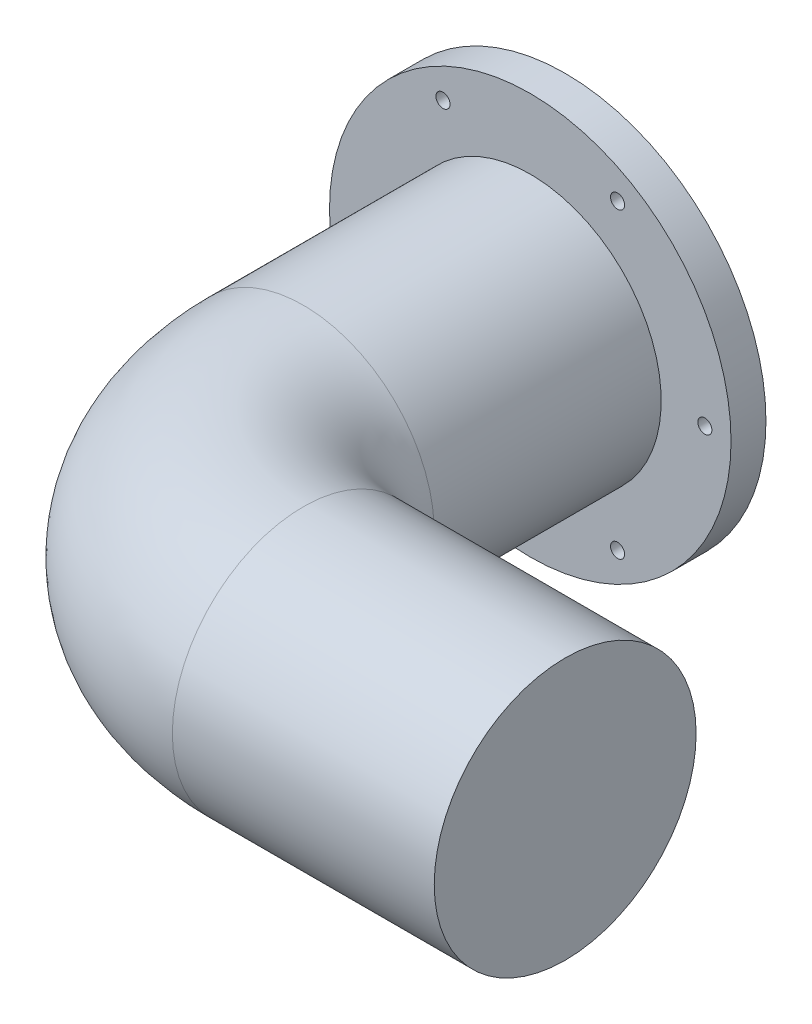
ISO-10303-21;
HEADER;
FILE_DESCRIPTION(('STEP AP214'),'2;1');
FILE_NAME('part.step','',(''),(''),'','','');
FILE_SCHEMA(('AUTOMOTIVE_DESIGN { 1 0 10303 214 1 1 1 1 }'));
ENDSEC;
DATA;
#1=APPLICATION_CONTEXT('core data for automotive mechanical design processes');
#2=APPLICATION_PROTOCOL_DEFINITION('international standard','automotive_design',2000,#1);
#3=PRODUCT_CONTEXT('',#1,'mechanical');
#4=PRODUCT('Part','Part','',(#3));
#5=PRODUCT_RELATED_PRODUCT_CATEGORY('part','',(#4));
#6=PRODUCT_DEFINITION_FORMATION('','',#4);
#7=PRODUCT_DEFINITION_CONTEXT('part definition',#1,'design');
#8=PRODUCT_DEFINITION('design','',#6,#7);
#9=PRODUCT_DEFINITION_SHAPE('','',#8);
#10=(LENGTH_UNIT() NAMED_UNIT(*) SI_UNIT(.MILLI.,.METRE.));
#11=(NAMED_UNIT(*) PLANE_ANGLE_UNIT() SI_UNIT($,.RADIAN.));
#12=(NAMED_UNIT(*) SI_UNIT($,.STERADIAN.) SOLID_ANGLE_UNIT());
#13=UNCERTAINTY_MEASURE_WITH_UNIT(LENGTH_MEASURE(1.E-05),#10,'distance_accuracy_value','');
#14=(GEOMETRIC_REPRESENTATION_CONTEXT(3) GLOBAL_UNCERTAINTY_ASSIGNED_CONTEXT((#13)) GLOBAL_UNIT_ASSIGNED_CONTEXT((#10,
#11,#12)) REPRESENTATION_CONTEXT('',''));
#15=CARTESIAN_POINT('',(0.,0.,0.));
#16=DIRECTION('',(0.,0.,1.));
#17=DIRECTION('',(1.,0.,0.));
#18=AXIS2_PLACEMENT_3D('',#15,#16,#17);
#19=CARTESIAN_POINT('',(-125.,0.,-115.));
#20=DIRECTION('',(0.,0.,-1.));
#21=DIRECTION('',(-1.,0.,0.));
#22=AXIS2_PLACEMENT_3D('',#19,#20,#21);
#23=PLANE('',#22);
#24=CARTESIAN_POINT('',(-150.,43.3012701892219,-115.));
#25=DIRECTION('',(0.,0.,1.));
#26=DIRECTION('',(1.,0.,0.));
#27=AXIS2_PLACEMENT_3D('',#24,#25,#26);
#28=CIRCLE('',#27,2.0193);
#29=CARTESIAN_POINT('',(-147.9807,43.3012701892219,-115.));
#30=VERTEX_POINT('',#29);
#31=EDGE_CURVE('E131',#30,#30,#28,.T.);
#32=ORIENTED_EDGE('',*,*,#31,.F.);
#33=EDGE_LOOP('',(#32));
#34=FACE_BOUND('',#33,.T.);
#35=CARTESIAN_POINT('',(-125.,0.,-115.));
#36=DIRECTION('',(0.,0.,-1.));
#37=DIRECTION('',(-1.,0.,0.));
#38=AXIS2_PLACEMENT_3D('',#35,#36,#37);
#39=CIRCLE('',#38,37.5);
#40=CARTESIAN_POINT('',(-162.5,0.,-115.));
#41=VERTEX_POINT('',#40);
#42=EDGE_CURVE('E11',#41,#41,#39,.T.);
#43=ORIENTED_EDGE('',*,*,#42,.T.);
#44=EDGE_LOOP('',(#43));
#45=FACE_BOUND('',#44,.T.);
#46=CARTESIAN_POINT('',(-125.,0.,-115.));
#47=DIRECTION('',(0.,0.,-1.));
#48=DIRECTION('',(-1.,0.,0.));
#49=AXIS2_PLACEMENT_3D('',#46,#47,#48);
#50=CIRCLE('',#49,57.5);
#51=CARTESIAN_POINT('',(-182.5,0.,-115.));
#52=VERTEX_POINT('',#51);
#53=EDGE_CURVE('E79',#52,#52,#50,.T.);
#54=ORIENTED_EDGE('',*,*,#53,.F.);
#55=EDGE_LOOP('',(#54));
#56=FACE_BOUND('',#55,.T.);
#57=CARTESIAN_POINT('',(-100.,43.3012701892219,-115.));
#58=DIRECTION('',(0.,0.,1.));
#59=DIRECTION('',(1.,0.,0.));
#60=AXIS2_PLACEMENT_3D('',#57,#58,#59);
#61=CIRCLE('',#60,2.0193);
#62=CARTESIAN_POINT('',(-97.9807,43.3012701892219,-115.));
#63=VERTEX_POINT('',#62);
#64=EDGE_CURVE('E91',#63,#63,#61,.T.);
#65=ORIENTED_EDGE('',*,*,#64,.F.);
#66=EDGE_LOOP('',(#65));
#67=FACE_BOUND('',#66,.T.);
#68=CARTESIAN_POINT('',(-75.,0.,-115.));
#69=DIRECTION('',(0.,0.,1.));
#70=DIRECTION('',(1.,0.,0.));
#71=AXIS2_PLACEMENT_3D('',#68,#69,#70);
#72=CIRCLE('',#71,2.0193);
#73=CARTESIAN_POINT('',(-72.9807,0.,-115.));
#74=VERTEX_POINT('',#73);
#75=EDGE_CURVE('E99',#74,#74,#72,.T.);
#76=ORIENTED_EDGE('',*,*,#75,.F.);
#77=EDGE_LOOP('',(#76));
#78=FACE_BOUND('',#77,.T.);
#79=CARTESIAN_POINT('',(-100.,-43.3012701892219,-115.));
#80=DIRECTION('',(0.,0.,1.));
#81=DIRECTION('',(1.,0.,0.));
#82=AXIS2_PLACEMENT_3D('',#79,#80,#81);
#83=CIRCLE('',#82,2.0193);
#84=CARTESIAN_POINT('',(-97.9807,-43.3012701892219,-115.));
#85=VERTEX_POINT('',#84);
#86=EDGE_CURVE('E107',#85,#85,#83,.T.);
#87=ORIENTED_EDGE('',*,*,#86,.F.);
#88=EDGE_LOOP('',(#87));
#89=FACE_BOUND('',#88,.T.);
#90=CARTESIAN_POINT('',(-150.,-43.3012701892219,-115.));
#91=DIRECTION('',(0.,0.,1.));
#92=DIRECTION('',(1.,0.,0.));
#93=AXIS2_PLACEMENT_3D('',#90,#91,#92);
#94=CIRCLE('',#93,2.0193);
#95=CARTESIAN_POINT('',(-147.9807,-43.3012701892219,-115.));
#96=VERTEX_POINT('',#95);
#97=EDGE_CURVE('E115',#96,#96,#94,.T.);
#98=ORIENTED_EDGE('',*,*,#97,.F.);
#99=EDGE_LOOP('',(#98));
#100=FACE_BOUND('',#99,.T.);
#101=CARTESIAN_POINT('',(-175.,0.,-115.));
#102=DIRECTION('',(0.,0.,1.));
#103=DIRECTION('',(1.,0.,0.));
#104=AXIS2_PLACEMENT_3D('',#101,#102,#103);
#105=CIRCLE('',#104,2.0193);
#106=CARTESIAN_POINT('',(-172.9807,0.,-115.));
#107=VERTEX_POINT('',#106);
#108=EDGE_CURVE('E123',#107,#107,#105,.T.);
#109=ORIENTED_EDGE('',*,*,#108,.F.);
#110=EDGE_LOOP('',(#109));
#111=FACE_BOUND('',#110,.T.);
#112=ADVANCED_FACE('F55',(#34,#45,#56,#67,#78,#89,#100,#111),#23,.F.);
#113=CARTESIAN_POINT('',(-125.,0.,-50.));
#114=DIRECTION('',(0.,0.,-1.));
#115=DIRECTION('',(-1.,0.,0.));
#116=AXIS2_PLACEMENT_3D('',#113,#114,#115);
#117=CYLINDRICAL_SURFACE('',#116,37.5);
#118=CARTESIAN_POINT('',(-125.,0.,-50.));
#119=DIRECTION('',(0.,0.,1.));
#120=DIRECTION('',(1.,0.,0.));
#121=AXIS2_PLACEMENT_3D('',#118,#119,#120);
#122=CIRCLE('',#121,37.5);
#123=CARTESIAN_POINT('',(-162.5,0.,-50.));
#124=VERTEX_POINT('',#123);
#125=EDGE_CURVE('E63',#124,#124,#122,.T.);
#126=ORIENTED_EDGE('',*,*,#125,.F.);
#127=EDGE_LOOP('',(#126));
#128=FACE_BOUND('',#127,.T.);
#129=ORIENTED_EDGE('',*,*,#42,.F.);
#130=EDGE_LOOP('',(#129));
#131=FACE_BOUND('',#130,.T.);
#132=ADVANCED_FACE('F217',(#128,#131),#117,.T.);
#133=CARTESIAN_POINT('',(0.,0.,0.));
#134=DIRECTION('',(1.,0.,0.));
#135=DIRECTION('',(0.,0.,-1.));
#136=AXIS2_PLACEMENT_3D('',#133,#134,#135);
#137=PLANE('',#136);
#138=CARTESIAN_POINT('',(0.,0.,0.));
#139=DIRECTION('',(1.,0.,0.));
#140=DIRECTION('',(0.,0.,-1.));
#141=AXIS2_PLACEMENT_3D('',#138,#139,#140);
#142=CIRCLE('',#141,37.5);
#143=CARTESIAN_POINT('',(0.,0.,-37.5));
#144=VERTEX_POINT('',#143);
#145=EDGE_CURVE('E73',#144,#144,#142,.T.);
#146=ORIENTED_EDGE('',*,*,#145,.T.);
#147=EDGE_LOOP('',(#146));
#148=FACE_BOUND('',#147,.T.);
#149=ADVANCED_FACE('F57',(#148),#137,.T.);
#150=CARTESIAN_POINT('',(0.,0.,0.));
#151=DIRECTION('',(-1.,0.,0.));
#152=DIRECTION('',(0.,0.,1.));
#153=AXIS2_PLACEMENT_3D('',#150,#151,#152);
#154=CYLINDRICAL_SURFACE('',#153,37.5);
#155=CARTESIAN_POINT('',(-75.,0.,0.));
#156=DIRECTION('',(1.,0.,0.));
#157=DIRECTION('',(0.,0.,-1.));
#158=AXIS2_PLACEMENT_3D('',#155,#156,#157);
#159=CIRCLE('',#158,37.5);
#160=CARTESIAN_POINT('',(-75.,0.,37.5));
#161=VERTEX_POINT('',#160);
#162=EDGE_CURVE('E68',#161,#161,#159,.T.);
#163=ORIENTED_EDGE('',*,*,#162,.T.);
#164=EDGE_LOOP('',(#163));
#165=FACE_BOUND('',#164,.T.);
#166=ORIENTED_EDGE('',*,*,#145,.F.);
#167=EDGE_LOOP('',(#166));
#168=FACE_BOUND('',#167,.T.);
#169=ADVANCED_FACE('F215',(#165,#168),#154,.T.);
#170=CARTESIAN_POINT('',(-75.,0.,-50.));
#171=DIRECTION('',(0.,-1.,0.));
#172=DIRECTION('',(0.,0.,-1.));
#173=AXIS2_PLACEMENT_3D('',#170,#171,#172);
#174=TOROIDAL_SURFACE('',#173,50.,37.5);
#175=CARTESIAN_POINT('',(-75.,0.,-50.));
#176=DIRECTION('',(0.,-1.,0.));
#177=DIRECTION('',(0.,0.,-1.));
#178=AXIS2_PLACEMENT_3D('',#175,#176,#177);
#179=CIRCLE('',#178,87.5);
#180=EDGE_CURVE('',#161,#124,#179,.T.);
#181=ORIENTED_EDGE('',*,*,#162,.F.);
#182=ORIENTED_EDGE('',*,*,#125,.T.);
#183=ORIENTED_EDGE('',*,*,#180,.T.);
#184=ORIENTED_EDGE('',*,*,#180,.F.);
#185=EDGE_LOOP('',(#181,#183,#182,#184));
#186=FACE_BOUND('',#185,.T.);
#187=ADVANCED_FACE('F209',(#186),#174,.T.);
#188=CARTESIAN_POINT('',(-125.,0.,-115.));
#189=DIRECTION('',(0.,0.,-1.));
#190=DIRECTION('',(-1.,0.,0.));
#191=AXIS2_PLACEMENT_3D('',#188,#189,#190);
#192=CYLINDRICAL_SURFACE('',#191,57.5);
#193=ORIENTED_EDGE('',*,*,#53,.T.);
#194=EDGE_LOOP('',(#193));
#195=FACE_BOUND('',#194,.T.);
#196=CARTESIAN_POINT('',(-125.,0.,-125.));
#197=DIRECTION('',(0.,0.,-1.));
#198=DIRECTION('',(-1.,0.,0.));
#199=AXIS2_PLACEMENT_3D('',#196,#197,#198);
#200=CIRCLE('',#199,57.5);
#201=CARTESIAN_POINT('',(-182.5,0.,-125.));
#202=VERTEX_POINT('',#201);
#203=EDGE_CURVE('E80',#202,#202,#200,.T.);
#204=ORIENTED_EDGE('',*,*,#203,.F.);
#205=EDGE_LOOP('',(#204));
#206=FACE_BOUND('',#205,.T.);
#207=ADVANCED_FACE('F190',(#195,#206),#192,.T.);
#208=CARTESIAN_POINT('',(-125.,0.,-125.));
#209=DIRECTION('',(0.,0.,1.));
#210=DIRECTION('',(1.,0.,0.));
#211=AXIS2_PLACEMENT_3D('',#208,#209,#210);
#212=PLANE('',#211);
#213=CARTESIAN_POINT('',(-134.166005189315,25.9274825015745,-125.));
#214=DIRECTION('',(0.,0.,-1.));
#215=DIRECTION('',(-1.,0.,0.));
#216=AXIS2_PLACEMENT_3D('',#213,#214,#215);
#217=CIRCLE('',#216,7.00000000000004);
#218=CARTESIAN_POINT('',(-141.166005189315,25.9274825015745,-125.));
#219=VERTEX_POINT('',#218);
#220=EDGE_CURVE('E140',#219,#219,#217,.T.);
#221=ORIENTED_EDGE('',*,*,#220,.F.);
#222=EDGE_LOOP('',(#221));
#223=FACE_BOUND('',#222,.T.);
#224=CARTESIAN_POINT('',(-107.909337502927,21.5443555348297,-125.));
#225=DIRECTION('',(0.,0.,-1.));
#226=DIRECTION('',(-1.,0.,0.));
#227=AXIS2_PLACEMENT_3D('',#224,#225,#226);
#228=CIRCLE('',#227,7.);
#229=CARTESIAN_POINT('',(-114.909337502927,21.5443555348297,-125.));
#230=VERTEX_POINT('',#229);
#231=EDGE_CURVE('E165',#230,#230,#228,.T.);
#232=ORIENTED_EDGE('',*,*,#231,.F.);
#233=EDGE_LOOP('',(#232));
#234=FACE_BOUND('',#233,.T.);
#235=CARTESIAN_POINT('',(-97.6670307521967,-3.02634963258334,-125.));
#236=DIRECTION('',(0.,0.,-1.));
#237=DIRECTION('',(-1.,0.,0.));
#238=AXIS2_PLACEMENT_3D('',#235,#236,#237);
#239=CIRCLE('',#238,7.);
#240=CARTESIAN_POINT('',(-104.667030752197,-3.02634963258334,-125.));
#241=VERTEX_POINT('',#240);
#242=EDGE_CURVE('E157',#241,#241,#239,.T.);
#243=ORIENTED_EDGE('',*,*,#242,.F.);
#244=EDGE_LOOP('',(#243));
#245=FACE_BOUND('',#244,.T.);
#246=CARTESIAN_POINT('',(-113.03637217792,-24.7612925618747,-125.));
#247=DIRECTION('',(0.,0.,-1.));
#248=DIRECTION('',(-1.,0.,0.));
#249=AXIS2_PLACEMENT_3D('',#246,#247,#248);
#250=CIRCLE('',#249,7.00000000000003);
#251=CARTESIAN_POINT('',(-120.03637217792,-24.7612925618747,-125.));
#252=VERTEX_POINT('',#251);
#253=EDGE_CURVE('E148',#252,#252,#250,.T.);
#254=ORIENTED_EDGE('',*,*,#253,.F.);
#255=EDGE_LOOP('',(#254));
#256=FACE_BOUND('',#255,.T.);
#257=CARTESIAN_POINT('',(-139.61592,-23.2943100896679,-125.));
#258=DIRECTION('',(0.,0.,-1.));
#259=DIRECTION('',(-1.,0.,0.));
#260=AXIS2_PLACEMENT_3D('',#257,#258,#259);
#261=CIRCLE('',#260,7.00000000000001);
#262=CARTESIAN_POINT('',(-146.61592,-23.2943100896679,-125.));
#263=VERTEX_POINT('',#262);
#264=EDGE_CURVE('E149',#263,#263,#261,.T.);
#265=ORIENTED_EDGE('',*,*,#264,.F.);
#266=EDGE_LOOP('',(#265));
#267=FACE_BOUND('',#266,.T.);
#268=CARTESIAN_POINT('',(-152.5,-1.92031473636372E-13,-125.));
#269=DIRECTION('',(0.,0.,-1.));
#270=DIRECTION('',(-1.,0.,0.));
#271=AXIS2_PLACEMENT_3D('',#268,#269,#270);
#272=CIRCLE('',#271,7.00000000000004);
#273=CARTESIAN_POINT('',(-159.5,-1.92031473636372E-13,-125.));
#274=VERTEX_POINT('',#273);
#275=EDGE_CURVE('E136',#274,#274,#272,.T.);
#276=ORIENTED_EDGE('',*,*,#275,.F.);
#277=EDGE_LOOP('',(#276));
#278=FACE_BOUND('',#277,.T.);
#279=CARTESIAN_POINT('',(-150.,43.3012701892219,-125.));
#280=DIRECTION('',(0.,0.,1.));
#281=DIRECTION('',(1.,0.,0.));
#282=AXIS2_PLACEMENT_3D('',#279,#280,#281);
#283=CIRCLE('',#282,2.0193);
#284=CARTESIAN_POINT('',(-147.9807,43.3012701892219,-125.));
#285=VERTEX_POINT('',#284);
#286=EDGE_CURVE('E127',#285,#285,#283,.T.);
#287=ORIENTED_EDGE('',*,*,#286,.T.);
#288=EDGE_LOOP('',(#287));
#289=FACE_BOUND('',#288,.T.);
#290=CARTESIAN_POINT('',(-175.,0.,-125.));
#291=DIRECTION('',(0.,0.,1.));
#292=DIRECTION('',(1.,0.,0.));
#293=AXIS2_PLACEMENT_3D('',#290,#291,#292);
#294=CIRCLE('',#293,2.0193);
#295=CARTESIAN_POINT('',(-172.9807,0.,-125.));
#296=VERTEX_POINT('',#295);
#297=EDGE_CURVE('E119',#296,#296,#294,.T.);
#298=ORIENTED_EDGE('',*,*,#297,.T.);
#299=EDGE_LOOP('',(#298));
#300=FACE_BOUND('',#299,.T.);
#301=CARTESIAN_POINT('',(-150.,-43.3012701892219,-125.));
#302=DIRECTION('',(0.,0.,1.));
#303=DIRECTION('',(1.,0.,0.));
#304=AXIS2_PLACEMENT_3D('',#301,#302,#303);
#305=CIRCLE('',#304,2.0193);
#306=CARTESIAN_POINT('',(-147.9807,-43.3012701892219,-125.));
#307=VERTEX_POINT('',#306);
#308=EDGE_CURVE('E111',#307,#307,#305,.T.);
#309=ORIENTED_EDGE('',*,*,#308,.T.);
#310=EDGE_LOOP('',(#309));
#311=FACE_BOUND('',#310,.T.);
#312=CARTESIAN_POINT('',(-100.,-43.3012701892219,-125.));
#313=DIRECTION('',(0.,0.,1.));
#314=DIRECTION('',(1.,0.,0.));
#315=AXIS2_PLACEMENT_3D('',#312,#313,#314);
#316=CIRCLE('',#315,2.0193);
#317=CARTESIAN_POINT('',(-97.9807,-43.3012701892219,-125.));
#318=VERTEX_POINT('',#317);
#319=EDGE_CURVE('E103',#318,#318,#316,.T.);
#320=ORIENTED_EDGE('',*,*,#319,.T.);
#321=EDGE_LOOP('',(#320));
#322=FACE_BOUND('',#321,.T.);
#323=CARTESIAN_POINT('',(-75.,0.,-125.));
#324=DIRECTION('',(0.,0.,1.));
#325=DIRECTION('',(1.,0.,0.));
#326=AXIS2_PLACEMENT_3D('',#323,#324,#325);
#327=CIRCLE('',#326,2.0193);
#328=CARTESIAN_POINT('',(-72.9807,0.,-125.));
#329=VERTEX_POINT('',#328);
#330=EDGE_CURVE('E95',#329,#329,#327,.T.);
#331=ORIENTED_EDGE('',*,*,#330,.T.);
#332=EDGE_LOOP('',(#331));
#333=FACE_BOUND('',#332,.T.);
#334=CARTESIAN_POINT('',(-100.,43.3012701892219,-125.));
#335=DIRECTION('',(0.,0.,1.));
#336=DIRECTION('',(1.,0.,0.));
#337=AXIS2_PLACEMENT_3D('',#334,#335,#336);
#338=CIRCLE('',#337,2.0193);
#339=CARTESIAN_POINT('',(-97.9807,43.3012701892219,-125.));
#340=VERTEX_POINT('',#339);
#341=EDGE_CURVE('E84',#340,#340,#338,.T.);
#342=ORIENTED_EDGE('',*,*,#341,.T.);
#343=EDGE_LOOP('',(#342));
#344=FACE_BOUND('',#343,.T.);
#345=ORIENTED_EDGE('',*,*,#203,.T.);
#346=EDGE_LOOP('',(#345));
#347=FACE_BOUND('',#346,.T.);
#348=ADVANCED_FACE('F186',(#223,#234,#245,#256,#267,#278,#289,#300,#311,#322,#333,#344,#347),
#212,.F.);
#349=CARTESIAN_POINT('',(-100.,43.3012701892219,-115.));
#350=DIRECTION('',(0.,0.,1.));
#351=DIRECTION('',(1.,0.,0.));
#352=AXIS2_PLACEMENT_3D('',#349,#350,#351);
#353=CYLINDRICAL_SURFACE('',#352,2.0193);
#354=ORIENTED_EDGE('',*,*,#341,.F.);
#355=EDGE_LOOP('',(#354));
#356=FACE_BOUND('',#355,.T.);
#357=ORIENTED_EDGE('',*,*,#64,.T.);
#358=EDGE_LOOP('',(#357));
#359=FACE_BOUND('',#358,.T.);
#360=ADVANCED_FACE('F189',(#356,#359),#353,.F.);
#361=CARTESIAN_POINT('',(-75.,0.,-115.));
#362=DIRECTION('',(0.,0.,1.));
#363=DIRECTION('',(1.,0.,0.));
#364=AXIS2_PLACEMENT_3D('',#361,#362,#363);
#365=CYLINDRICAL_SURFACE('',#364,2.0193);
#366=ORIENTED_EDGE('',*,*,#330,.F.);
#367=EDGE_LOOP('',(#366));
#368=FACE_BOUND('',#367,.T.);
#369=ORIENTED_EDGE('',*,*,#75,.T.);
#370=EDGE_LOOP('',(#369));
#371=FACE_BOUND('',#370,.T.);
#372=ADVANCED_FACE('F233',(#368,#371),#365,.F.);
#373=CARTESIAN_POINT('',(-100.,-43.3012701892219,-115.));
#374=DIRECTION('',(0.,0.,1.));
#375=DIRECTION('',(1.,0.,0.));
#376=AXIS2_PLACEMENT_3D('',#373,#374,#375);
#377=CYLINDRICAL_SURFACE('',#376,2.0193);
#378=ORIENTED_EDGE('',*,*,#319,.F.);
#379=EDGE_LOOP('',(#378));
#380=FACE_BOUND('',#379,.T.);
#381=ORIENTED_EDGE('',*,*,#86,.T.);
#382=EDGE_LOOP('',(#381));
#383=FACE_BOUND('',#382,.T.);
#384=ADVANCED_FACE('F237',(#380,#383),#377,.F.);
#385=CARTESIAN_POINT('',(-150.,-43.3012701892219,-115.));
#386=DIRECTION('',(0.,0.,1.));
#387=DIRECTION('',(1.,0.,0.));
#388=AXIS2_PLACEMENT_3D('',#385,#386,#387);
#389=CYLINDRICAL_SURFACE('',#388,2.0193);
#390=ORIENTED_EDGE('',*,*,#308,.F.);
#391=EDGE_LOOP('',(#390));
#392=FACE_BOUND('',#391,.T.);
#393=ORIENTED_EDGE('',*,*,#97,.T.);
#394=EDGE_LOOP('',(#393));
#395=FACE_BOUND('',#394,.T.);
#396=ADVANCED_FACE('F241',(#392,#395),#389,.F.);
#397=CARTESIAN_POINT('',(-175.,0.,-115.));
#398=DIRECTION('',(0.,0.,1.));
#399=DIRECTION('',(1.,0.,0.));
#400=AXIS2_PLACEMENT_3D('',#397,#398,#399);
#401=CYLINDRICAL_SURFACE('',#400,2.0193);
#402=ORIENTED_EDGE('',*,*,#297,.F.);
#403=EDGE_LOOP('',(#402));
#404=FACE_BOUND('',#403,.T.);
#405=ORIENTED_EDGE('',*,*,#108,.T.);
#406=EDGE_LOOP('',(#405));
#407=FACE_BOUND('',#406,.T.);
#408=ADVANCED_FACE('F245',(#404,#407),#401,.F.);
#409=CARTESIAN_POINT('',(-150.,43.3012701892219,-115.));
#410=DIRECTION('',(0.,0.,1.));
#411=DIRECTION('',(1.,0.,0.));
#412=AXIS2_PLACEMENT_3D('',#409,#410,#411);
#413=CYLINDRICAL_SURFACE('',#412,2.0193);
#414=ORIENTED_EDGE('',*,*,#286,.F.);
#415=EDGE_LOOP('',(#414));
#416=FACE_BOUND('',#415,.T.);
#417=ORIENTED_EDGE('',*,*,#31,.T.);
#418=EDGE_LOOP('',(#417));
#419=FACE_BOUND('',#418,.T.);
#420=ADVANCED_FACE('F249',(#416,#419),#413,.F.);
#421=CARTESIAN_POINT('',(-152.5,-1.92031473636372E-13,-120.));
#422=DIRECTION('',(0.,0.,-1.));
#423=DIRECTION('',(-1.,0.,0.));
#424=AXIS2_PLACEMENT_3D('',#421,#422,#423);
#425=CYLINDRICAL_SURFACE('',#424,7.00000000000004);
#426=CARTESIAN_POINT('',(-152.5,-1.92031473636372E-13,-120.));
#427=DIRECTION('',(0.,0.,-1.));
#428=DIRECTION('',(-1.,0.,0.));
#429=AXIS2_PLACEMENT_3D('',#426,#427,#428);
#430=CIRCLE('',#429,7.00000000000004);
#431=CARTESIAN_POINT('',(-159.5,-1.92031473636372E-13,-120.));
#432=VERTEX_POINT('',#431);
#433=EDGE_CURVE('E135',#432,#432,#430,.T.);
#434=ORIENTED_EDGE('',*,*,#433,.F.);
#435=EDGE_LOOP('',(#434));
#436=FACE_BOUND('',#435,.T.);
#437=ORIENTED_EDGE('',*,*,#275,.T.);
#438=EDGE_LOOP('',(#437));
#439=FACE_BOUND('',#438,.T.);
#440=ADVANCED_FACE('F253',(#436,#439),#425,.F.);
#441=CARTESIAN_POINT('',(-152.5,-1.92031473636372E-13,-120.));
#442=DIRECTION('',(0.,0.,-1.));
#443=DIRECTION('',(-1.,0.,0.));
#444=AXIS2_PLACEMENT_3D('',#441,#442,#443);
#445=PLANE('',#444);
#446=ORIENTED_EDGE('',*,*,#433,.T.);
#447=EDGE_LOOP('',(#446));
#448=FACE_BOUND('',#447,.T.);
#449=ADVANCED_FACE('F257',(#448),#445,.T.);
#450=CARTESIAN_POINT('',(-139.61592,-23.2943100896679,-120.));
#451=DIRECTION('',(0.,0.,-1.));
#452=DIRECTION('',(-1.,0.,0.));
#453=AXIS2_PLACEMENT_3D('',#450,#451,#452);
#454=CYLINDRICAL_SURFACE('',#453,7.00000000000001);
#455=CARTESIAN_POINT('',(-139.61592,-23.2943100896679,-120.));
#456=DIRECTION('',(0.,0.,-1.));
#457=DIRECTION('',(-1.,0.,0.));
#458=AXIS2_PLACEMENT_3D('',#455,#456,#457);
#459=CIRCLE('',#458,7.00000000000001);
#460=CARTESIAN_POINT('',(-146.61592,-23.2943100896679,-120.));
#461=VERTEX_POINT('',#460);
#462=EDGE_CURVE('E176',#461,#461,#459,.T.);
#463=ORIENTED_EDGE('',*,*,#462,.F.);
#464=EDGE_LOOP('',(#463));
#465=FACE_BOUND('',#464,.T.);
#466=ORIENTED_EDGE('',*,*,#264,.T.);
#467=EDGE_LOOP('',(#466));
#468=FACE_BOUND('',#467,.T.);
#469=ADVANCED_FACE('F184',(#465,#468),#454,.F.);
#470=CARTESIAN_POINT('',(-139.61592,-23.2943100896679,-120.));
#471=DIRECTION('',(0.,0.,-1.));
#472=DIRECTION('',(-1.,0.,0.));
#473=AXIS2_PLACEMENT_3D('',#470,#471,#472);
#474=PLANE('',#473);
#475=ORIENTED_EDGE('',*,*,#462,.T.);
#476=EDGE_LOOP('',(#475));
#477=FACE_BOUND('',#476,.T.);
#478=ADVANCED_FACE('F270',(#477),#474,.T.);
#479=CARTESIAN_POINT('',(-113.03637217792,-24.7612925618747,-120.));
#480=DIRECTION('',(0.,0.,-1.));
#481=DIRECTION('',(-1.,0.,0.));
#482=AXIS2_PLACEMENT_3D('',#479,#480,#481);
#483=CYLINDRICAL_SURFACE('',#482,7.00000000000003);
#484=CARTESIAN_POINT('',(-113.03637217792,-24.7612925618747,-120.));
#485=DIRECTION('',(0.,0.,-1.));
#486=DIRECTION('',(-1.,0.,0.));
#487=AXIS2_PLACEMENT_3D('',#484,#485,#486);
#488=CIRCLE('',#487,7.00000000000003);
#489=CARTESIAN_POINT('',(-120.03637217792,-24.7612925618747,-120.));
#490=VERTEX_POINT('',#489);
#491=EDGE_CURVE('E144',#490,#490,#488,.T.);
#492=ORIENTED_EDGE('',*,*,#491,.F.);
#493=EDGE_LOOP('',(#492));
#494=FACE_BOUND('',#493,.T.);
#495=ORIENTED_EDGE('',*,*,#253,.T.);
#496=EDGE_LOOP('',(#495));
#497=FACE_BOUND('',#496,.T.);
#498=ADVANCED_FACE('F266',(#494,#497),#483,.F.);
#499=CARTESIAN_POINT('',(-113.03637217792,-24.7612925618747,-120.));
#500=DIRECTION('',(0.,0.,-1.));
#501=DIRECTION('',(-1.,0.,0.));
#502=AXIS2_PLACEMENT_3D('',#499,#500,#501);
#503=PLANE('',#502);
#504=ORIENTED_EDGE('',*,*,#491,.T.);
#505=EDGE_LOOP('',(#504));
#506=FACE_BOUND('',#505,.T.);
#507=ADVANCED_FACE('F262',(#506),#503,.T.);
#508=CARTESIAN_POINT('',(-97.6670307521967,-3.02634963258334,-120.));
#509=DIRECTION('',(0.,0.,-1.));
#510=DIRECTION('',(-1.,0.,0.));
#511=AXIS2_PLACEMENT_3D('',#508,#509,#510);
#512=CYLINDRICAL_SURFACE('',#511,7.);
#513=CARTESIAN_POINT('',(-97.6670307521967,-3.02634963258334,-120.));
#514=DIRECTION('',(0.,0.,-1.));
#515=DIRECTION('',(-1.,0.,0.));
#516=AXIS2_PLACEMENT_3D('',#513,#514,#515);
#517=CIRCLE('',#516,7.);
#518=CARTESIAN_POINT('',(-104.667030752197,-3.02634963258334,-120.));
#519=VERTEX_POINT('',#518);
#520=EDGE_CURVE('E153',#519,#519,#517,.T.);
#521=ORIENTED_EDGE('',*,*,#520,.F.);
#522=EDGE_LOOP('',(#521));
#523=FACE_BOUND('',#522,.T.);
#524=ORIENTED_EDGE('',*,*,#242,.T.);
#525=EDGE_LOOP('',(#524));
#526=FACE_BOUND('',#525,.T.);
#527=ADVANCED_FACE('F265',(#523,#526),#512,.F.);
#528=CARTESIAN_POINT('',(-97.6670307521967,-3.02634963258334,-120.));
#529=DIRECTION('',(0.,0.,-1.));
#530=DIRECTION('',(-1.,0.,0.));
#531=AXIS2_PLACEMENT_3D('',#528,#529,#530);
#532=PLANE('',#531);
#533=ORIENTED_EDGE('',*,*,#520,.T.);
#534=EDGE_LOOP('',(#533));
#535=FACE_BOUND('',#534,.T.);
#536=ADVANCED_FACE('F272',(#535),#532,.T.);
#537=CARTESIAN_POINT('',(-107.909337502927,21.5443555348297,-120.));
#538=DIRECTION('',(0.,0.,-1.));
#539=DIRECTION('',(-1.,0.,0.));
#540=AXIS2_PLACEMENT_3D('',#537,#538,#539);
#541=CYLINDRICAL_SURFACE('',#540,7.);
#542=CARTESIAN_POINT('',(-107.909337502927,21.5443555348297,-120.));
#543=DIRECTION('',(0.,0.,-1.));
#544=DIRECTION('',(-1.,0.,0.));
#545=AXIS2_PLACEMENT_3D('',#542,#543,#544);
#546=CIRCLE('',#545,7.);
#547=CARTESIAN_POINT('',(-114.909337502927,21.5443555348297,-120.));
#548=VERTEX_POINT('',#547);
#549=EDGE_CURVE('E161',#548,#548,#546,.T.);
#550=ORIENTED_EDGE('',*,*,#549,.F.);
#551=EDGE_LOOP('',(#550));
#552=FACE_BOUND('',#551,.T.);
#553=ORIENTED_EDGE('',*,*,#231,.T.);
#554=EDGE_LOOP('',(#553));
#555=FACE_BOUND('',#554,.T.);
#556=ADVANCED_FACE('F275',(#552,#555),#541,.F.);
#557=CARTESIAN_POINT('',(-107.909337502927,21.5443555348297,-120.));
#558=DIRECTION('',(0.,0.,-1.));
#559=DIRECTION('',(-1.,0.,0.));
#560=AXIS2_PLACEMENT_3D('',#557,#558,#559);
#561=PLANE('',#560);
#562=ORIENTED_EDGE('',*,*,#549,.T.);
#563=EDGE_LOOP('',(#562));
#564=FACE_BOUND('',#563,.T.);
#565=ADVANCED_FACE('F280',(#564),#561,.T.);
#566=CARTESIAN_POINT('',(-134.166005189315,25.9274825015745,-120.));
#567=DIRECTION('',(0.,0.,-1.));
#568=DIRECTION('',(-1.,0.,0.));
#569=AXIS2_PLACEMENT_3D('',#566,#567,#568);
#570=CYLINDRICAL_SURFACE('',#569,7.00000000000004);
#571=CARTESIAN_POINT('',(-134.166005189315,25.9274825015745,-120.));
#572=DIRECTION('',(0.,0.,-1.));
#573=DIRECTION('',(-1.,0.,0.));
#574=AXIS2_PLACEMENT_3D('',#571,#572,#573);
#575=CIRCLE('',#574,7.00000000000004);
#576=CARTESIAN_POINT('',(-141.166005189315,25.9274825015745,-120.));
#577=VERTEX_POINT('',#576);
#578=EDGE_CURVE('E169',#577,#577,#575,.T.);
#579=ORIENTED_EDGE('',*,*,#578,.F.);
#580=EDGE_LOOP('',(#579));
#581=FACE_BOUND('',#580,.T.);
#582=ORIENTED_EDGE('',*,*,#220,.T.);
#583=EDGE_LOOP('',(#582));
#584=FACE_BOUND('',#583,.T.);
#585=ADVANCED_FACE('F283',(#581,#584),#570,.F.);
#586=CARTESIAN_POINT('',(-134.166005189315,25.9274825015745,-120.));
#587=DIRECTION('',(0.,0.,-1.));
#588=DIRECTION('',(-1.,0.,0.));
#589=AXIS2_PLACEMENT_3D('',#586,#587,#588);
#590=PLANE('',#589);
#591=ORIENTED_EDGE('',*,*,#578,.T.);
#592=EDGE_LOOP('',(#591));
#593=FACE_BOUND('',#592,.T.);
#594=ADVANCED_FACE('F288',(#593),#590,.T.);
#595=CLOSED_SHELL('',(#112,#132,#149,#169,#187,#207,#348,#360,#372,#384,#396,#408,#420,#440,
#449,#469,#478,#498,#507,#527,#536,#556,#565,#585,#594));
#596=MANIFOLD_SOLID_BREP('B2',#595);
#597=ADVANCED_BREP_SHAPE_REPRESENTATION('',(#18,#596),#14);
#598=SHAPE_DEFINITION_REPRESENTATION(#9,#597);
ENDSEC;
END-ISO-10303-21;
